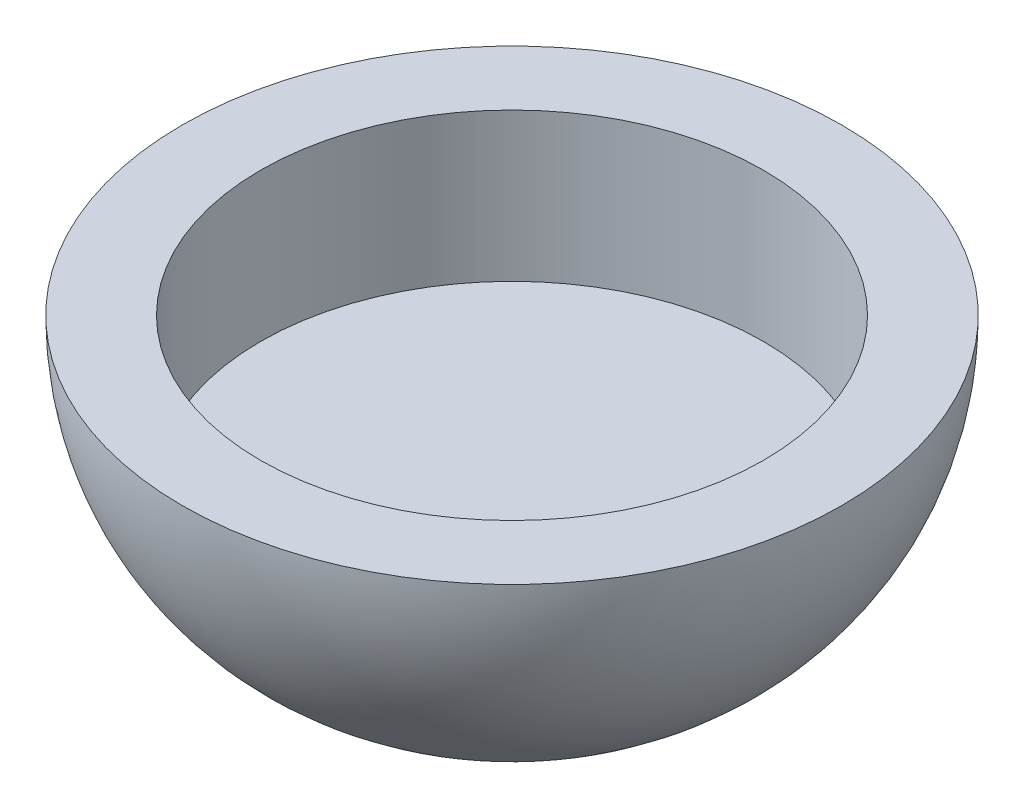
ISO-10303-21;
HEADER;
FILE_DESCRIPTION(('STEP AP214'),'2;1');
FILE_NAME('part.step','',(''),(''),'','','');
FILE_SCHEMA(('AUTOMOTIVE_DESIGN { 1 0 10303 214 1 1 1 1 }'));
ENDSEC;
DATA;
#1=APPLICATION_CONTEXT('core data for automotive mechanical design processes');
#2=APPLICATION_PROTOCOL_DEFINITION('international standard','automotive_design',2000,#1);
#3=PRODUCT_CONTEXT('',#1,'mechanical');
#4=PRODUCT('Part','Part','',(#3));
#5=PRODUCT_RELATED_PRODUCT_CATEGORY('part','',(#4));
#6=PRODUCT_DEFINITION_FORMATION('','',#4);
#7=PRODUCT_DEFINITION_CONTEXT('part definition',#1,'design');
#8=PRODUCT_DEFINITION('design','',#6,#7);
#9=PRODUCT_DEFINITION_SHAPE('','',#8);
#10=(LENGTH_UNIT() NAMED_UNIT(*) SI_UNIT(.MILLI.,.METRE.));
#11=(NAMED_UNIT(*) PLANE_ANGLE_UNIT() SI_UNIT($,.RADIAN.));
#12=(NAMED_UNIT(*) SI_UNIT($,.STERADIAN.) SOLID_ANGLE_UNIT());
#13=UNCERTAINTY_MEASURE_WITH_UNIT(LENGTH_MEASURE(1.E-05),#10,'distance_accuracy_value','');
#14=(GEOMETRIC_REPRESENTATION_CONTEXT(3) GLOBAL_UNCERTAINTY_ASSIGNED_CONTEXT((#13)) GLOBAL_UNIT_ASSIGNED_CONTEXT((#10,
#11,#12)) REPRESENTATION_CONTEXT('',''));
#15=CARTESIAN_POINT('',(0.,0.,0.));
#16=DIRECTION('',(0.,0.,1.));
#17=DIRECTION('',(1.,0.,0.));
#18=AXIS2_PLACEMENT_3D('',#15,#16,#17);
#19=CARTESIAN_POINT('',(0.,9.,0.));
#20=DIRECTION('',(0.,1.,0.));
#21=DIRECTION('',(0.,0.,1.));
#22=AXIS2_PLACEMENT_3D('',#19,#20,#21);
#23=PLANE('',#22);
#24=CARTESIAN_POINT('',(0.,9.,0.));
#25=DIRECTION('',(0.,1.,0.));
#26=DIRECTION('',(0.,0.,1.));
#27=AXIS2_PLACEMENT_3D('',#24,#25,#26);
#28=CIRCLE('',#27,7.625);
#29=CARTESIAN_POINT('',(0.,9.,7.625));
#30=VERTEX_POINT('',#29);
#31=EDGE_CURVE('E44',#30,#30,#28,.T.);
#32=ORIENTED_EDGE('',*,*,#31,.F.);
#33=EDGE_LOOP('',(#32));
#34=FACE_BOUND('',#33,.T.);
#35=CARTESIAN_POINT('',(0.,9.,0.));
#36=DIRECTION('',(0.,-1.,0.));
#37=DIRECTION('',(0.,0.,-1.));
#38=AXIS2_PLACEMENT_3D('',#35,#36,#37);
#39=CIRCLE('',#38,10.);
#40=CARTESIAN_POINT('',(0.,9.,-10.));
#41=VERTEX_POINT('',#40);
#42=EDGE_CURVE('E10',#41,#41,#39,.T.);
#43=ORIENTED_EDGE('',*,*,#42,.F.);
#44=EDGE_LOOP('',(#43));
#45=FACE_BOUND('',#44,.T.);
#46=ADVANCED_FACE('F30',(#34,#45),#23,.T.);
#47=CARTESIAN_POINT('',(0.,9.,0.));
#48=DIRECTION('',(0.,-1.,0.));
#49=DIRECTION('',(0.,0.,-1.));
#50=AXIS2_PLACEMENT_3D('',#47,#48,#49);
#51=DEGENERATE_TOROIDAL_SURFACE('',#50,1.,9.,.T.);
#52=ORIENTED_EDGE('',*,*,#42,.T.);
#53=EDGE_LOOP('',(#52));
#54=FACE_BOUND('',#53,.T.);
#55=CARTESIAN_POINT('',(0.,0.,0.));
#56=DIRECTION('',(0.,-1.,0.));
#57=DIRECTION('',(0.,0.,-1.));
#58=AXIS2_PLACEMENT_3D('',#55,#56,#57);
#59=CIRCLE('',#58,1.);
#60=CARTESIAN_POINT('',(0.,0.,-1.));
#61=VERTEX_POINT('',#60);
#62=EDGE_CURVE('E36',#61,#61,#59,.T.);
#63=ORIENTED_EDGE('',*,*,#62,.F.);
#64=EDGE_LOOP('',(#63));
#65=FACE_BOUND('',#64,.T.);
#66=ADVANCED_FACE('F54',(#54,#65),#51,.T.);
#67=CARTESIAN_POINT('',(1.,0.,0.));
#68=DIRECTION('',(0.,-1.,0.));
#69=DIRECTION('',(0.,0.,-1.));
#70=AXIS2_PLACEMENT_3D('',#67,#68,#69);
#71=PLANE('',#70);
#72=ORIENTED_EDGE('',*,*,#62,.T.);
#73=EDGE_LOOP('',(#72));
#74=FACE_BOUND('',#73,.T.);
#75=ADVANCED_FACE('F58',(#74),#71,.T.);
#76=CARTESIAN_POINT('',(0.,4.5,0.));
#77=DIRECTION('',(0.,1.,0.));
#78=DIRECTION('',(0.,0.,1.));
#79=AXIS2_PLACEMENT_3D('',#76,#77,#78);
#80=CYLINDRICAL_SURFACE('',#79,7.625);
#81=CARTESIAN_POINT('',(0.,4.5,0.));
#82=DIRECTION('',(0.,1.,0.));
#83=DIRECTION('',(0.,0.,1.));
#84=AXIS2_PLACEMENT_3D('',#81,#82,#83);
#85=CIRCLE('',#84,7.625);
#86=CARTESIAN_POINT('',(0.,4.5,7.625));
#87=VERTEX_POINT('',#86);
#88=EDGE_CURVE('E40',#87,#87,#85,.T.);
#89=ORIENTED_EDGE('',*,*,#88,.F.);
#90=EDGE_LOOP('',(#89));
#91=FACE_BOUND('',#90,.T.);
#92=ORIENTED_EDGE('',*,*,#31,.T.);
#93=EDGE_LOOP('',(#92));
#94=FACE_BOUND('',#93,.T.);
#95=ADVANCED_FACE('F50',(#91,#94),#80,.F.);
#96=CARTESIAN_POINT('',(0.,4.5,0.));
#97=DIRECTION('',(0.,1.,0.));
#98=DIRECTION('',(0.,0.,1.));
#99=AXIS2_PLACEMENT_3D('',#96,#97,#98);
#100=PLANE('',#99);
#101=ORIENTED_EDGE('',*,*,#88,.T.);
#102=EDGE_LOOP('',(#101));
#103=FACE_BOUND('',#102,.T.);
#104=ADVANCED_FACE('F67',(#103),#100,.T.);
#105=CLOSED_SHELL('',(#46,#66,#75,#95,#104));
#106=MANIFOLD_SOLID_BREP('B2',#105);
#107=ADVANCED_BREP_SHAPE_REPRESENTATION('',(#18,#106),#14);
#108=SHAPE_DEFINITION_REPRESENTATION(#9,#107);
ENDSEC;
END-ISO-10303-21;
